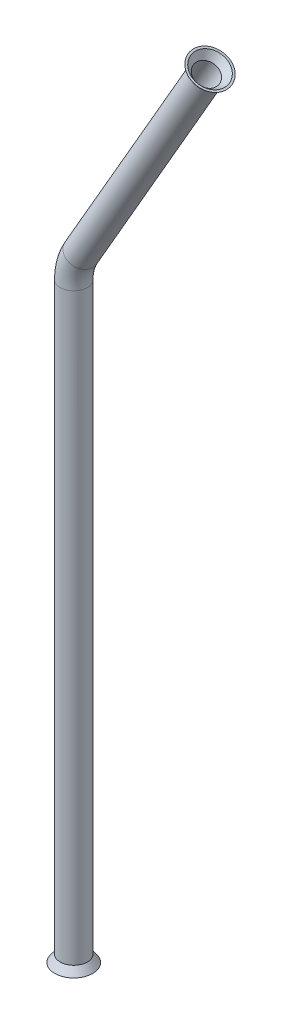
ISO-10303-21;
HEADER;
FILE_DESCRIPTION(('STEP AP214'),'2;1');
FILE_NAME('part.step','',(''),(''),'','','');
FILE_SCHEMA(('AUTOMOTIVE_DESIGN { 1 0 10303 214 1 1 1 1 }'));
ENDSEC;
DATA;
#1=APPLICATION_CONTEXT('core data for automotive mechanical design processes');
#2=APPLICATION_PROTOCOL_DEFINITION('international standard','automotive_design',2000,#1);
#3=PRODUCT_CONTEXT('',#1,'mechanical');
#4=PRODUCT('Part','Part','',(#3));
#5=PRODUCT_RELATED_PRODUCT_CATEGORY('part','',(#4));
#6=PRODUCT_DEFINITION_FORMATION('','',#4);
#7=PRODUCT_DEFINITION_CONTEXT('part definition',#1,'design');
#8=PRODUCT_DEFINITION('design','',#6,#7);
#9=PRODUCT_DEFINITION_SHAPE('','',#8);
#10=(LENGTH_UNIT() NAMED_UNIT(*) SI_UNIT(.MILLI.,.METRE.));
#11=(NAMED_UNIT(*) PLANE_ANGLE_UNIT() SI_UNIT($,.RADIAN.));
#12=(NAMED_UNIT(*) SI_UNIT($,.STERADIAN.) SOLID_ANGLE_UNIT());
#13=UNCERTAINTY_MEASURE_WITH_UNIT(LENGTH_MEASURE(1.E-05),#10,'distance_accuracy_value','');
#14=(GEOMETRIC_REPRESENTATION_CONTEXT(3) GLOBAL_UNCERTAINTY_ASSIGNED_CONTEXT((#13)) GLOBAL_UNIT_ASSIGNED_CONTEXT((#10,
#11,#12)) REPRESENTATION_CONTEXT('',''));
#15=CARTESIAN_POINT('',(0.,0.,0.));
#16=DIRECTION('',(0.,0.,1.));
#17=DIRECTION('',(1.,0.,0.));
#18=AXIS2_PLACEMENT_3D('',#15,#16,#17);
#19=CARTESIAN_POINT('',(0.,0.,0.));
#20=DIRECTION('',(0.,1.,0.));
#21=DIRECTION('',(0.,0.,1.));
#22=AXIS2_PLACEMENT_3D('',#19,#20,#21);
#23=CYLINDRICAL_SURFACE('',#22,4.826);
#24=CARTESIAN_POINT('',(0.,206.956941603564,0.));
#25=DIRECTION('',(0.,1.,0.));
#26=DIRECTION('',(0.,0.,1.));
#27=AXIS2_PLACEMENT_3D('',#24,#25,#26);
#28=CIRCLE('',#27,4.826);
#29=CARTESIAN_POINT('',(-4.82599999999996,206.956941603564,0.));
#30=VERTEX_POINT('',#29);
#31=EDGE_CURVE('E50',#30,#30,#28,.T.);
#32=ORIENTED_EDGE('',*,*,#31,.F.);
#33=EDGE_LOOP('',(#32));
#34=FACE_BOUND('',#33,.T.);
#35=CARTESIAN_POINT('',(0.,0.,0.));
#36=DIRECTION('',(0.,-1.,0.));
#37=DIRECTION('',(0.,0.,-1.));
#38=AXIS2_PLACEMENT_3D('',#35,#36,#37);
#39=CIRCLE('',#38,4.826);
#40=CARTESIAN_POINT('',(0.,0.,-4.826));
#41=VERTEX_POINT('',#40);
#42=EDGE_CURVE('E57',#41,#41,#39,.T.);
#43=ORIENTED_EDGE('',*,*,#42,.F.);
#44=EDGE_LOOP('',(#43));
#45=FACE_BOUND('',#44,.T.);
#46=ADVANCED_FACE('F32',(#34,#45),#23,.T.);
#47=CARTESIAN_POINT('',(19.0500000000001,206.956941603564,0.));
#48=DIRECTION('',(0.,0.,-1.));
#49=DIRECTION('',(-1.,0.,0.));
#50=AXIS2_PLACEMENT_3D('',#47,#48,#49);
#51=TOROIDAL_SURFACE('',#50,19.05,4.826);
#52=CARTESIAN_POINT('',(2.5522160579065,216.481941603564,0.));
#53=DIRECTION('',(0.500000000000001,0.866025403784438,0.));
#54=DIRECTION('',(0.,0.,1.));
#55=AXIS2_PLACEMENT_3D('',#52,#53,#54);
#56=CIRCLE('',#55,4.826);
#57=CARTESIAN_POINT('',(-1.6272225407572,218.894941603564,0.));
#58=VERTEX_POINT('',#57);
#59=EDGE_CURVE('E36',#58,#58,#56,.T.);
#60=CARTESIAN_POINT('',(19.0500000000001,206.956941603564,0.));
#61=DIRECTION('',(0.,0.,-1.));
#62=DIRECTION('',(-1.,0.,0.));
#63=AXIS2_PLACEMENT_3D('',#60,#61,#62);
#64=CIRCLE('',#63,23.876);
#65=EDGE_CURVE('',#30,#58,#64,.T.);
#66=ORIENTED_EDGE('',*,*,#31,.T.);
#67=ORIENTED_EDGE('',*,*,#59,.F.);
#68=ORIENTED_EDGE('',*,*,#65,.T.);
#69=ORIENTED_EDGE('',*,*,#65,.F.);
#70=EDGE_LOOP('',(#66,#68,#67,#69));
#71=FACE_BOUND('',#70,.T.);
#72=ADVANCED_FACE('F98',(#71),#51,.T.);
#73=CARTESIAN_POINT('',(2.55221605790653,216.481941603564,0.));
#74=DIRECTION('',(0.500000000000001,0.866025403784438,0.));
#75=DIRECTION('',(-0.866025403784438,0.500000000000001,0.));
#76=AXIS2_PLACEMENT_3D('',#73,#74,#75);
#77=CYLINDRICAL_SURFACE('',#76,4.826);
#78=CARTESIAN_POINT('',(47.0022160579065,293.4716,0.));
#79=DIRECTION('',(0.500000000000001,0.866025403784438,0.));
#80=DIRECTION('',(0.,0.,1.));
#81=AXIS2_PLACEMENT_3D('',#78,#79,#80);
#82=CIRCLE('',#81,4.826);
#83=CARTESIAN_POINT('',(47.0022160579065,293.4716,4.826));
#84=VERTEX_POINT('',#83);
#85=EDGE_CURVE('E45',#84,#84,#82,.T.);
#86=ORIENTED_EDGE('',*,*,#85,.F.);
#87=EDGE_LOOP('',(#86));
#88=FACE_BOUND('',#87,.T.);
#89=ORIENTED_EDGE('',*,*,#59,.T.);
#90=EDGE_LOOP('',(#89));
#91=FACE_BOUND('',#90,.T.);
#92=ADVANCED_FACE('F34',(#88,#91),#77,.T.);
#93=CARTESIAN_POINT('',(0.,0.,0.));
#94=DIRECTION('',(0.,1.,0.));
#95=DIRECTION('',(0.,0.,1.));
#96=AXIS2_PLACEMENT_3D('',#93,#94,#95);
#97=CYLINDRICAL_SURFACE('',#96,4.064);
#98=CARTESIAN_POINT('',(0.,206.956941603564,0.));
#99=DIRECTION('',(0.,1.,0.));
#100=DIRECTION('',(0.,0.,1.));
#101=AXIS2_PLACEMENT_3D('',#98,#99,#100);
#102=CIRCLE('',#101,4.064);
#103=CARTESIAN_POINT('',(-4.06399999999996,206.956941603564,0.));
#104=VERTEX_POINT('',#103);
#105=EDGE_CURVE('E40',#104,#104,#102,.F.);
#106=ORIENTED_EDGE('',*,*,#105,.F.);
#107=EDGE_LOOP('',(#106));
#108=FACE_BOUND('',#107,.T.);
#109=CARTESIAN_POINT('',(0.,0.,0.));
#110=DIRECTION('',(0.,-1.,0.));
#111=DIRECTION('',(0.,0.,-1.));
#112=AXIS2_PLACEMENT_3D('',#109,#110,#111);
#113=CIRCLE('',#112,4.064);
#114=CARTESIAN_POINT('',(0.,0.,-4.064));
#115=VERTEX_POINT('',#114);
#116=EDGE_CURVE('E61',#115,#115,#113,.T.);
#117=ORIENTED_EDGE('',*,*,#116,.T.);
#118=EDGE_LOOP('',(#117));
#119=FACE_BOUND('',#118,.T.);
#120=ADVANCED_FACE('F97',(#108,#119),#97,.F.);
#121=CARTESIAN_POINT('',(19.0500000000001,206.956941603564,0.));
#122=DIRECTION('',(0.,0.,-1.));
#123=DIRECTION('',(-1.,0.,0.));
#124=AXIS2_PLACEMENT_3D('',#121,#122,#123);
#125=TOROIDAL_SURFACE('',#124,19.05,4.064);
#126=CARTESIAN_POINT('',(2.5522160579065,216.481941603564,0.));
#127=DIRECTION('',(0.500000000000001,0.866025403784438,0.));
#128=DIRECTION('',(0.,0.,1.));
#129=AXIS2_PLACEMENT_3D('',#126,#127,#128);
#130=CIRCLE('',#129,4.064);
#131=CARTESIAN_POINT('',(-0.967311183073461,218.513941603564,0.));
#132=VERTEX_POINT('',#131);
#133=EDGE_CURVE('E10',#132,#132,#130,.F.);
#134=CARTESIAN_POINT('',(19.0500000000001,206.956941603564,0.));
#135=DIRECTION('',(0.,0.,-1.));
#136=DIRECTION('',(-1.,0.,0.));
#137=AXIS2_PLACEMENT_3D('',#134,#135,#136);
#138=CIRCLE('',#137,23.114);
#139=EDGE_CURVE('',#104,#132,#138,.T.);
#140=ORIENTED_EDGE('',*,*,#105,.T.);
#141=ORIENTED_EDGE('',*,*,#133,.F.);
#142=ORIENTED_EDGE('',*,*,#139,.T.);
#143=ORIENTED_EDGE('',*,*,#139,.F.);
#144=EDGE_LOOP('',(#140,#142,#141,#143));
#145=FACE_BOUND('',#144,.T.);
#146=ADVANCED_FACE('F110',(#145),#125,.F.);
#147=CARTESIAN_POINT('',(2.55221605790653,216.481941603564,0.));
#148=DIRECTION('',(0.500000000000001,0.866025403784438,0.));
#149=DIRECTION('',(-0.866025403784438,0.500000000000001,0.));
#150=AXIS2_PLACEMENT_3D('',#147,#148,#149);
#151=CYLINDRICAL_SURFACE('',#150,4.064);
#152=CARTESIAN_POINT('',(47.0022160579064,293.4716,0.));
#153=DIRECTION('',(0.500000000000001,0.866025403784438,0.));
#154=DIRECTION('',(-0.866025403784438,0.500000000000001,0.));
#155=AXIS2_PLACEMENT_3D('',#152,#153,#154);
#156=CIRCLE('',#155,4.06400000000003);
#157=CARTESIAN_POINT('',(43.4826888169264,295.5036,0.));
#158=VERTEX_POINT('',#157);
#159=EDGE_CURVE('E72',#158,#158,#156,.T.);
#160=ORIENTED_EDGE('',*,*,#159,.T.);
#161=EDGE_LOOP('',(#160));
#162=FACE_BOUND('',#161,.T.);
#163=ORIENTED_EDGE('',*,*,#133,.T.);
#164=EDGE_LOOP('',(#163));
#165=FACE_BOUND('',#164,.T.);
#166=ADVANCED_FACE('F108',(#162,#165),#151,.F.);
#167=CARTESIAN_POINT('',(0.,0.,0.));
#168=DIRECTION('',(0.,-1.,0.));
#169=DIRECTION('',(0.,0.,-1.));
#170=AXIS2_PLACEMENT_3D('',#167,#168,#169);
#171=CONICAL_SURFACE('',#170,4.826,0.645771823237903);
#172=CARTESIAN_POINT('',(0.,-2.54,0.));
#173=DIRECTION('',(0.,-1.,0.));
#174=DIRECTION('',(0.,0.,-1.));
#175=AXIS2_PLACEMENT_3D('',#172,#173,#174);
#176=CIRCLE('',#175,6.7400272872611);
#177=CARTESIAN_POINT('',(0.,-2.54,-6.7400272872611));
#178=VERTEX_POINT('',#177);
#179=EDGE_CURVE('E52',#178,#178,#176,.T.);
#180=ORIENTED_EDGE('',*,*,#179,.F.);
#181=EDGE_LOOP('',(#180));
#182=FACE_BOUND('',#181,.T.);
#183=ORIENTED_EDGE('',*,*,#42,.T.);
#184=EDGE_LOOP('',(#183));
#185=FACE_BOUND('',#184,.T.);
#186=ADVANCED_FACE('F107',(#182,#185),#171,.T.);
#187=CARTESIAN_POINT('',(0.,-2.54,0.));
#188=DIRECTION('',(0.,-1.,0.));
#189=DIRECTION('',(0.,0.,-1.));
#190=AXIS2_PLACEMENT_3D('',#187,#188,#189);
#191=PLANE('',#190);
#192=CARTESIAN_POINT('',(0.,-2.54,0.));
#193=DIRECTION('',(0.,-1.,0.));
#194=DIRECTION('',(0.,0.,-1.));
#195=AXIS2_PLACEMENT_3D('',#192,#193,#194);
#196=CIRCLE('',#195,5.9780272872611);
#197=CARTESIAN_POINT('',(0.,-2.54,-5.9780272872611));
#198=VERTEX_POINT('',#197);
#199=EDGE_CURVE('E66',#198,#198,#196,.T.);
#200=ORIENTED_EDGE('',*,*,#199,.F.);
#201=EDGE_LOOP('',(#200));
#202=FACE_BOUND('',#201,.T.);
#203=ORIENTED_EDGE('',*,*,#179,.T.);
#204=EDGE_LOOP('',(#203));
#205=FACE_BOUND('',#204,.T.);
#206=ADVANCED_FACE('F117',(#202,#205),#191,.T.);
#207=CARTESIAN_POINT('',(0.,-2.54,0.));
#208=DIRECTION('',(0.,-1.,0.));
#209=DIRECTION('',(0.,0.,-1.));
#210=AXIS2_PLACEMENT_3D('',#207,#208,#209);
#211=CONICAL_SURFACE('',#210,5.9780272872611,0.645771823237903);
#212=ORIENTED_EDGE('',*,*,#199,.T.);
#213=EDGE_LOOP('',(#212));
#214=FACE_BOUND('',#213,.T.);
#215=ORIENTED_EDGE('',*,*,#116,.F.);
#216=EDGE_LOOP('',(#215));
#217=FACE_BOUND('',#216,.T.);
#218=ADVANCED_FACE('F91',(#214,#217),#211,.F.);
#219=CARTESIAN_POINT('',(47.0022160579064,293.4716,0.));
#220=DIRECTION('',(0.500000000000001,0.866025403784438,0.));
#221=DIRECTION('',(-0.866025403784438,0.500000000000001,0.));
#222=AXIS2_PLACEMENT_3D('',#219,#220,#221);
#223=CONICAL_SURFACE('',#222,4.82599999999999,0.645771823237903);
#224=CARTESIAN_POINT('',(48.2722160579064,295.671304525612,0.));
#225=DIRECTION('',(0.500000000000001,0.866025403784438,0.));
#226=DIRECTION('',(-0.866025403784438,0.500000000000001,0.));
#227=AXIS2_PLACEMENT_3D('',#224,#225,#226);
#228=CIRCLE('',#227,6.74002728726109);
#229=CARTESIAN_POINT('',(42.435181204938,299.041318169243,0.));
#230=VERTEX_POINT('',#229);
#231=EDGE_CURVE('E69',#230,#230,#228,.T.);
#232=ORIENTED_EDGE('',*,*,#231,.F.);
#233=EDGE_LOOP('',(#232));
#234=FACE_BOUND('',#233,.T.);
#235=ORIENTED_EDGE('',*,*,#85,.T.);
#236=EDGE_LOOP('',(#235));
#237=FACE_BOUND('',#236,.T.);
#238=ADVANCED_FACE('F85',(#234,#237),#223,.T.);
#239=CARTESIAN_POINT('',(48.2722160579064,295.671304525612,0.));
#240=DIRECTION('',(0.500000000000001,0.866025403784438,0.));
#241=DIRECTION('',(-0.866025403784438,0.500000000000001,0.));
#242=AXIS2_PLACEMENT_3D('',#239,#240,#241);
#243=PLANE('',#242);
#244=CARTESIAN_POINT('',(48.2722160579064,295.671304525612,0.));
#245=DIRECTION('',(0.500000000000001,0.866025403784438,0.));
#246=DIRECTION('',(-0.866025403784438,0.500000000000001,0.));
#247=AXIS2_PLACEMENT_3D('',#244,#245,#246);
#248=CIRCLE('',#247,5.97802728726111);
#249=CARTESIAN_POINT('',(43.0950925626217,298.660318169243,0.));
#250=VERTEX_POINT('',#249);
#251=EDGE_CURVE('E75',#250,#250,#248,.T.);
#252=ORIENTED_EDGE('',*,*,#251,.F.);
#253=EDGE_LOOP('',(#252));
#254=FACE_BOUND('',#253,.T.);
#255=ORIENTED_EDGE('',*,*,#231,.T.);
#256=EDGE_LOOP('',(#255));
#257=FACE_BOUND('',#256,.T.);
#258=ADVANCED_FACE('F82',(#254,#257),#243,.T.);
#259=CARTESIAN_POINT('',(48.2722160579064,295.671304525612,0.));
#260=DIRECTION('',(0.500000000000001,0.866025403784438,0.));
#261=DIRECTION('',(-0.866025403784438,0.500000000000001,0.));
#262=AXIS2_PLACEMENT_3D('',#259,#260,#261);
#263=CONICAL_SURFACE('',#262,5.97802728726111,0.645771823237903);
#264=ORIENTED_EDGE('',*,*,#251,.T.);
#265=EDGE_LOOP('',(#264));
#266=FACE_BOUND('',#265,.T.);
#267=ORIENTED_EDGE('',*,*,#159,.F.);
#268=EDGE_LOOP('',(#267));
#269=FACE_BOUND('',#268,.T.);
#270=ADVANCED_FACE('F79',(#266,#269),#263,.F.);
#271=CLOSED_SHELL('',(#46,#72,#92,#120,#146,#166,#186,#206,#218,#238,#258,#270));
#272=MANIFOLD_SOLID_BREP('B2',#271);
#273=ADVANCED_BREP_SHAPE_REPRESENTATION('',(#18,#272),#14);
#274=SHAPE_DEFINITION_REPRESENTATION(#9,#273);
ENDSEC;
END-ISO-10303-21;
